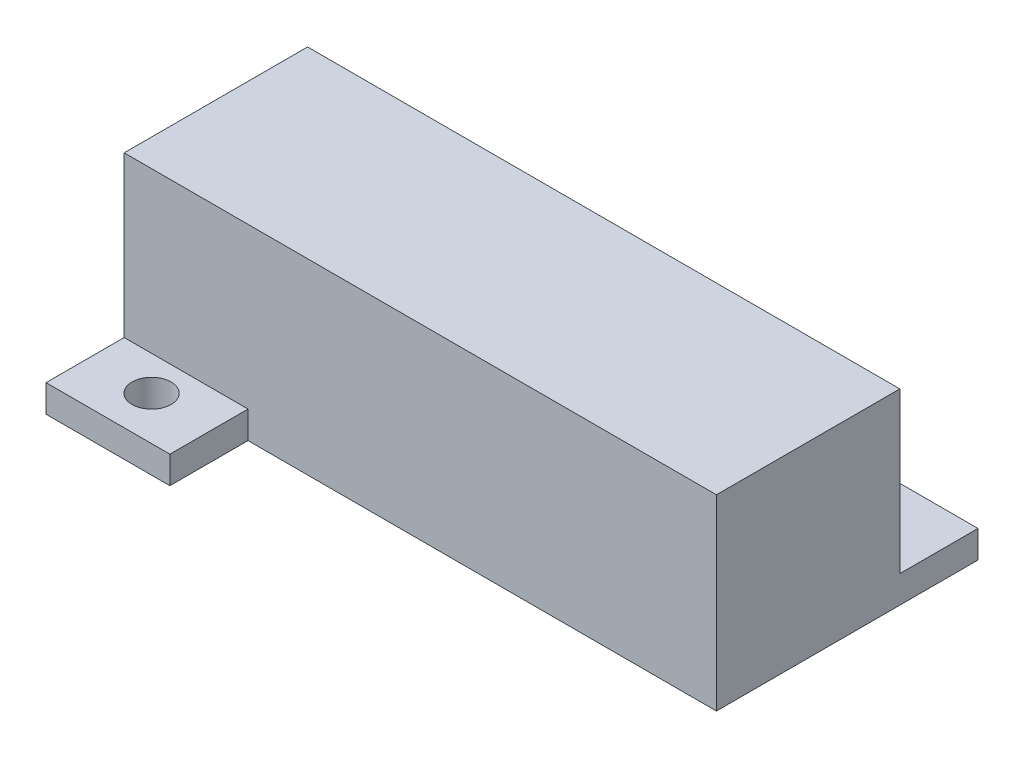
ISO-10303-21;
HEADER;
FILE_DESCRIPTION(('STEP AP214'),'2;1');
FILE_NAME('part.step','',(''),(''),'','','');
FILE_SCHEMA(('AUTOMOTIVE_DESIGN { 1 0 10303 214 1 1 1 1 }'));
ENDSEC;
DATA;
#1=APPLICATION_CONTEXT('core data for automotive mechanical design processes');
#2=APPLICATION_PROTOCOL_DEFINITION('international standard','automotive_design',2000,#1);
#3=PRODUCT_CONTEXT('',#1,'mechanical');
#4=PRODUCT('Part','Part','',(#3));
#5=PRODUCT_RELATED_PRODUCT_CATEGORY('part','',(#4));
#6=PRODUCT_DEFINITION_FORMATION('','',#4);
#7=PRODUCT_DEFINITION_CONTEXT('part definition',#1,'design');
#8=PRODUCT_DEFINITION('design','',#6,#7);
#9=PRODUCT_DEFINITION_SHAPE('','',#8);
#10=(LENGTH_UNIT() NAMED_UNIT(*) SI_UNIT(.MILLI.,.METRE.));
#11=(NAMED_UNIT(*) PLANE_ANGLE_UNIT() SI_UNIT($,.RADIAN.));
#12=(NAMED_UNIT(*) SI_UNIT($,.STERADIAN.) SOLID_ANGLE_UNIT());
#13=UNCERTAINTY_MEASURE_WITH_UNIT(LENGTH_MEASURE(1.E-05),#10,'distance_accuracy_value','');
#14=(GEOMETRIC_REPRESENTATION_CONTEXT(3) GLOBAL_UNCERTAINTY_ASSIGNED_CONTEXT((#13)) GLOBAL_UNIT_ASSIGNED_CONTEXT((#10,
#11,#12)) REPRESENTATION_CONTEXT('',''));
#15=CARTESIAN_POINT('',(0.,0.,0.));
#16=DIRECTION('',(0.,0.,1.));
#17=DIRECTION('',(1.,0.,0.));
#18=AXIS2_PLACEMENT_3D('',#15,#16,#17);
#19=CARTESIAN_POINT('',(0.,2.3114,0.));
#20=DIRECTION('',(0.,1.,0.));
#21=DIRECTION('',(0.,0.,1.));
#22=AXIS2_PLACEMENT_3D('',#19,#20,#21);
#23=PLANE('',#22);
#24=DIRECTION('',(1.,0.,0.));
#25=VECTOR('',#24,1.);
#26=CARTESIAN_POINT('',(50.038,2.3114,-6.604));
#27=LINE('',#26,#25);
#28=CARTESIAN_POINT('',(0.,2.3114,-6.604));
#29=VERTEX_POINT('',#28);
#30=CARTESIAN_POINT('',(10.4648,2.3114,-6.604));
#31=VERTEX_POINT('',#30);
#32=EDGE_CURVE('E55',#29,#31,#27,.T.);
#33=ORIENTED_EDGE('',*,*,#32,.F.);
#34=DIRECTION('',(0.,0.,1.));
#35=VECTOR('',#34,1.);
#36=CARTESIAN_POINT('',(0.,2.3114,-22.098));
#37=LINE('',#36,#35);
#38=CARTESIAN_POINT('',(0.,2.3114,0.));
#39=VERTEX_POINT('',#38);
#40=EDGE_CURVE('E151',#29,#39,#37,.T.);
#41=ORIENTED_EDGE('',*,*,#40,.T.);
#42=DIRECTION('',(1.,0.,0.));
#43=VECTOR('',#42,1.);
#44=CARTESIAN_POINT('',(0.,2.3114,0.));
#45=LINE('',#44,#43);
#46=CARTESIAN_POINT('',(10.4648,2.3114,0.));
#47=VERTEX_POINT('',#46);
#48=EDGE_CURVE('E153',#39,#47,#45,.T.);
#49=ORIENTED_EDGE('',*,*,#48,.T.);
#50=DIRECTION('',(0.,0.,-1.));
#51=VECTOR('',#50,1.);
#52=CARTESIAN_POINT('',(10.4648,2.3114,0.));
#53=LINE('',#52,#51);
#54=EDGE_CURVE('E156',#47,#31,#53,.T.);
#55=ORIENTED_EDGE('',*,*,#54,.T.);
#56=EDGE_LOOP('',(#33,#41,#49,#55));
#57=FACE_BOUND('',#56,.T.);
#58=CARTESIAN_POINT('',(5.2324,2.3114,-3.68299999999999));
#59=DIRECTION('',(0.,1.,0.));
#60=DIRECTION('',(0.,0.,1.));
#61=AXIS2_PLACEMENT_3D('',#58,#59,#60);
#62=CIRCLE('',#61,1.651);
#63=CARTESIAN_POINT('',(5.2324,2.3114,-2.03199999999999));
#64=VERTEX_POINT('',#63);
#65=EDGE_CURVE('E145',#64,#64,#62,.T.);
#66=ORIENTED_EDGE('',*,*,#65,.F.);
#67=EDGE_LOOP('',(#66));
#68=FACE_BOUND('',#67,.T.);
#69=ADVANCED_FACE('F32',(#57,#68),#23,.T.);
#70=DIRECTION('',(-1.,0.,0.));
#71=VECTOR('',#70,1.);
#72=CARTESIAN_POINT('',(50.038,2.3114,-22.098));
#73=LINE('',#72,#71);
#74=CARTESIAN_POINT('',(50.038,2.3114,-22.098));
#75=VERTEX_POINT('',#74);
#76=CARTESIAN_POINT('',(39.5732,2.3114,-22.098));
#77=VERTEX_POINT('',#76);
#78=EDGE_CURVE('E47',#75,#77,#73,.T.);
#79=ORIENTED_EDGE('',*,*,#78,.F.);
#80=DIRECTION('',(0.,0.,-1.));
#81=VECTOR('',#80,1.);
#82=CARTESIAN_POINT('',(50.038,2.3114,-6.604));
#83=LINE('',#82,#81);
#84=CARTESIAN_POINT('',(50.038,2.3114,-28.702));
#85=VERTEX_POINT('',#84);
#86=EDGE_CURVE('E131',#75,#85,#83,.T.);
#87=ORIENTED_EDGE('',*,*,#86,.T.);
#88=DIRECTION('',(-1.,0.,0.));
#89=VECTOR('',#88,1.);
#90=CARTESIAN_POINT('',(50.038,2.3114,-28.702));
#91=LINE('',#90,#89);
#92=CARTESIAN_POINT('',(39.5732,2.3114,-28.702));
#93=VERTEX_POINT('',#92);
#94=EDGE_CURVE('E159',#85,#93,#91,.T.);
#95=ORIENTED_EDGE('',*,*,#94,.T.);
#96=DIRECTION('',(0.,0.,1.));
#97=VECTOR('',#96,1.);
#98=CARTESIAN_POINT('',(39.5732,2.3114,-28.702));
#99=LINE('',#98,#97);
#100=EDGE_CURVE('E161',#93,#77,#99,.T.);
#101=ORIENTED_EDGE('',*,*,#100,.T.);
#102=EDGE_LOOP('',(#79,#87,#95,#101));
#103=FACE_BOUND('',#102,.T.);
#104=CARTESIAN_POINT('',(44.8056,2.3114,-25.019));
#105=DIRECTION('',(0.,1.,0.));
#106=DIRECTION('',(0.,0.,1.));
#107=AXIS2_PLACEMENT_3D('',#104,#105,#106);
#108=CIRCLE('',#107,1.651);
#109=CARTESIAN_POINT('',(44.8056,2.3114,-23.368));
#110=VERTEX_POINT('',#109);
#111=EDGE_CURVE('E136',#110,#110,#108,.T.);
#112=ORIENTED_EDGE('',*,*,#111,.F.);
#113=EDGE_LOOP('',(#112));
#114=FACE_BOUND('',#113,.T.);
#115=ADVANCED_FACE('F237',(#103,#114),#23,.T.);
#116=CARTESIAN_POINT('',(0.,0.,0.));
#117=DIRECTION('',(0.,1.,0.));
#118=DIRECTION('',(0.,0.,1.));
#119=AXIS2_PLACEMENT_3D('',#116,#117,#118);
#120=PLANE('',#119);
#121=DIRECTION('',(0.,0.,1.));
#122=VECTOR('',#121,1.);
#123=CARTESIAN_POINT('',(0.,0.,-22.098));
#124=LINE('',#123,#122);
#125=CARTESIAN_POINT('',(0.,0.,-22.098));
#126=VERTEX_POINT('',#125);
#127=CARTESIAN_POINT('',(0.,0.,0.));
#128=VERTEX_POINT('',#127);
#129=EDGE_CURVE('E148',#126,#128,#124,.T.);
#130=ORIENTED_EDGE('',*,*,#129,.F.);
#131=DIRECTION('',(-1.,0.,0.));
#132=VECTOR('',#131,1.);
#133=CARTESIAN_POINT('',(39.5732,0.,-22.098));
#134=LINE('',#133,#132);
#135=CARTESIAN_POINT('',(39.5732,0.,-22.098));
#136=VERTEX_POINT('',#135);
#137=EDGE_CURVE('E154',#136,#126,#134,.T.);
#138=ORIENTED_EDGE('',*,*,#137,.F.);
#139=DIRECTION('',(0.,0.,1.));
#140=VECTOR('',#139,1.);
#141=CARTESIAN_POINT('',(39.5732,0.,-28.702));
#142=LINE('',#141,#140);
#143=CARTESIAN_POINT('',(39.5732,0.,-28.702));
#144=VERTEX_POINT('',#143);
#145=EDGE_CURVE('E175',#144,#136,#142,.T.);
#146=ORIENTED_EDGE('',*,*,#145,.F.);
#147=DIRECTION('',(-1.,0.,0.));
#148=VECTOR('',#147,1.);
#149=CARTESIAN_POINT('',(50.038,0.,-28.702));
#150=LINE('',#149,#148);
#151=CARTESIAN_POINT('',(50.038,0.,-28.702));
#152=VERTEX_POINT('',#151);
#153=EDGE_CURVE('E173',#152,#144,#150,.T.);
#154=ORIENTED_EDGE('',*,*,#153,.F.);
#155=DIRECTION('',(0.,0.,-1.));
#156=VECTOR('',#155,1.);
#157=CARTESIAN_POINT('',(50.038,0.,-6.604));
#158=LINE('',#157,#156);
#159=CARTESIAN_POINT('',(50.038,0.,-6.604));
#160=VERTEX_POINT('',#159);
#161=EDGE_CURVE('E171',#160,#152,#158,.T.);
#162=ORIENTED_EDGE('',*,*,#161,.F.);
#163=DIRECTION('',(1.,0.,0.));
#164=VECTOR('',#163,1.);
#165=CARTESIAN_POINT('',(10.4648,0.,-6.604));
#166=LINE('',#165,#164);
#167=CARTESIAN_POINT('',(10.4648,0.,-6.604));
#168=VERTEX_POINT('',#167);
#169=EDGE_CURVE('E169',#168,#160,#166,.T.);
#170=ORIENTED_EDGE('',*,*,#169,.F.);
#171=DIRECTION('',(0.,0.,-1.));
#172=VECTOR('',#171,1.);
#173=CARTESIAN_POINT('',(10.4648,0.,0.));
#174=LINE('',#173,#172);
#175=CARTESIAN_POINT('',(10.4648,0.,0.));
#176=VERTEX_POINT('',#175);
#177=EDGE_CURVE('E167',#176,#168,#174,.T.);
#178=ORIENTED_EDGE('',*,*,#177,.F.);
#179=DIRECTION('',(1.,0.,0.));
#180=VECTOR('',#179,1.);
#181=CARTESIAN_POINT('',(0.,0.,0.));
#182=LINE('',#181,#180);
#183=EDGE_CURVE('E165',#128,#176,#182,.T.);
#184=ORIENTED_EDGE('',*,*,#183,.F.);
#185=EDGE_LOOP('',(#130,#138,#146,#154,#162,#170,#178,#184));
#186=FACE_BOUND('',#185,.T.);
#187=CARTESIAN_POINT('',(5.2324,0.,-3.68299999999999));
#188=DIRECTION('',(0.,1.,0.));
#189=DIRECTION('',(0.,0.,1.));
#190=AXIS2_PLACEMENT_3D('',#187,#188,#189);
#191=CIRCLE('',#190,1.651);
#192=CARTESIAN_POINT('',(5.2324,0.,-2.03199999999999));
#193=VERTEX_POINT('',#192);
#194=EDGE_CURVE('E143',#193,#193,#191,.T.);
#195=ORIENTED_EDGE('',*,*,#194,.T.);
#196=EDGE_LOOP('',(#195));
#197=FACE_BOUND('',#196,.T.);
#198=CARTESIAN_POINT('',(44.8056,0.,-25.019));
#199=DIRECTION('',(0.,1.,0.));
#200=DIRECTION('',(0.,0.,1.));
#201=AXIS2_PLACEMENT_3D('',#198,#199,#200);
#202=CIRCLE('',#201,1.651);
#203=CARTESIAN_POINT('',(44.8056,0.,-23.368));
#204=VERTEX_POINT('',#203);
#205=EDGE_CURVE('E132',#204,#204,#202,.T.);
#206=ORIENTED_EDGE('',*,*,#205,.T.);
#207=EDGE_LOOP('',(#206));
#208=FACE_BOUND('',#207,.T.);
#209=ADVANCED_FACE('F204',(#186,#197,#208),#120,.F.);
#210=CARTESIAN_POINT('',(0.,2.3114,-22.098));
#211=DIRECTION('',(1.,0.,0.));
#212=DIRECTION('',(0.,0.,-1.));
#213=AXIS2_PLACEMENT_3D('',#210,#211,#212);
#214=PLANE('',#213);
#215=ORIENTED_EDGE('',*,*,#129,.T.);
#216=DIRECTION('',(0.,-1.,0.));
#217=VECTOR('',#216,1.);
#218=CARTESIAN_POINT('',(0.,2.3114,0.));
#219=LINE('',#218,#217);
#220=EDGE_CURVE('E11',#39,#128,#219,.T.);
#221=ORIENTED_EDGE('',*,*,#220,.F.);
#222=ORIENTED_EDGE('',*,*,#40,.F.);
#223=DIRECTION('',(0.,-1.,0.));
#224=VECTOR('',#223,1.);
#225=CARTESIAN_POINT('',(0.,15.8242,-6.604));
#226=LINE('',#225,#224);
#227=CARTESIAN_POINT('',(0.,15.8242,-6.604));
#228=VERTEX_POINT('',#227);
#229=EDGE_CURVE('E133',#228,#29,#226,.T.);
#230=ORIENTED_EDGE('',*,*,#229,.F.);
#231=DIRECTION('',(0.,0.,1.));
#232=VECTOR('',#231,1.);
#233=CARTESIAN_POINT('',(0.,15.8242,-6.604));
#234=LINE('',#233,#232);
#235=CARTESIAN_POINT('',(0.,15.8242,-22.098));
#236=VERTEX_POINT('',#235);
#237=EDGE_CURVE('E118',#236,#228,#234,.T.);
#238=ORIENTED_EDGE('',*,*,#237,.F.);
#239=DIRECTION('',(0.,-1.,0.));
#240=VECTOR('',#239,1.);
#241=CARTESIAN_POINT('',(0.,2.3114,-22.098));
#242=LINE('',#241,#240);
#243=EDGE_CURVE('E115',#236,#126,#242,.T.);
#244=ORIENTED_EDGE('',*,*,#243,.T.);
#245=EDGE_LOOP('',(#215,#221,#222,#230,#238,#244));
#246=FACE_BOUND('',#245,.T.);
#247=ADVANCED_FACE('F34',(#246),#214,.F.);
#248=CARTESIAN_POINT('',(0.,2.3114,0.));
#249=DIRECTION('',(0.,0.,-1.));
#250=DIRECTION('',(-1.,0.,0.));
#251=AXIS2_PLACEMENT_3D('',#248,#249,#250);
#252=PLANE('',#251);
#253=ORIENTED_EDGE('',*,*,#183,.T.);
#254=DIRECTION('',(0.,-1.,0.));
#255=VECTOR('',#254,1.);
#256=CARTESIAN_POINT('',(10.4648,2.3114,0.));
#257=LINE('',#256,#255);
#258=EDGE_CURVE('E40',#47,#176,#257,.T.);
#259=ORIENTED_EDGE('',*,*,#258,.F.);
#260=ORIENTED_EDGE('',*,*,#48,.F.);
#261=ORIENTED_EDGE('',*,*,#220,.T.);
#262=EDGE_LOOP('',(#253,#259,#260,#261));
#263=FACE_BOUND('',#262,.T.);
#264=ADVANCED_FACE('F227',(#263),#252,.F.);
#265=CARTESIAN_POINT('',(10.4648,2.3114,0.));
#266=DIRECTION('',(-1.,0.,0.));
#267=DIRECTION('',(0.,0.,1.));
#268=AXIS2_PLACEMENT_3D('',#265,#266,#267);
#269=PLANE('',#268);
#270=ORIENTED_EDGE('',*,*,#177,.T.);
#271=DIRECTION('',(0.,-1.,0.));
#272=VECTOR('',#271,1.);
#273=CARTESIAN_POINT('',(10.4648,2.3114,-6.604));
#274=LINE('',#273,#272);
#275=EDGE_CURVE('E190',#31,#168,#274,.T.);
#276=ORIENTED_EDGE('',*,*,#275,.F.);
#277=ORIENTED_EDGE('',*,*,#54,.F.);
#278=ORIENTED_EDGE('',*,*,#258,.T.);
#279=EDGE_LOOP('',(#270,#276,#277,#278));
#280=FACE_BOUND('',#279,.T.);
#281=ADVANCED_FACE('F197',(#280),#269,.F.);
#282=CARTESIAN_POINT('',(10.4648,2.3114,-6.604));
#283=DIRECTION('',(0.,0.,-1.));
#284=DIRECTION('',(-1.,0.,0.));
#285=AXIS2_PLACEMENT_3D('',#282,#283,#284);
#286=PLANE('',#285);
#287=ORIENTED_EDGE('',*,*,#169,.T.);
#288=DIRECTION('',(0.,-1.,0.));
#289=VECTOR('',#288,1.);
#290=CARTESIAN_POINT('',(50.038,2.3114,-6.604));
#291=LINE('',#290,#289);
#292=CARTESIAN_POINT('',(50.038,15.8242,-6.604));
#293=VERTEX_POINT('',#292);
#294=EDGE_CURVE('E188',#293,#160,#291,.T.);
#295=ORIENTED_EDGE('',*,*,#294,.F.);
#296=DIRECTION('',(1.,0.,0.));
#297=VECTOR('',#296,1.);
#298=CARTESIAN_POINT('',(50.038,15.8242,-6.604));
#299=LINE('',#298,#297);
#300=EDGE_CURVE('E125',#228,#293,#299,.T.);
#301=ORIENTED_EDGE('',*,*,#300,.F.);
#302=ORIENTED_EDGE('',*,*,#229,.T.);
#303=ORIENTED_EDGE('',*,*,#32,.T.);
#304=ORIENTED_EDGE('',*,*,#275,.T.);
#305=EDGE_LOOP('',(#287,#295,#301,#302,#303,#304));
#306=FACE_BOUND('',#305,.T.);
#307=ADVANCED_FACE('F209',(#306),#286,.F.);
#308=CARTESIAN_POINT('',(50.038,2.3114,-6.604));
#309=DIRECTION('',(-1.,0.,0.));
#310=DIRECTION('',(0.,0.,1.));
#311=AXIS2_PLACEMENT_3D('',#308,#309,#310);
#312=PLANE('',#311);
#313=ORIENTED_EDGE('',*,*,#161,.T.);
#314=DIRECTION('',(0.,-1.,0.));
#315=VECTOR('',#314,1.);
#316=CARTESIAN_POINT('',(50.038,2.3114,-28.702));
#317=LINE('',#316,#315);
#318=EDGE_CURVE('E185',#85,#152,#317,.T.);
#319=ORIENTED_EDGE('',*,*,#318,.F.);
#320=ORIENTED_EDGE('',*,*,#86,.F.);
#321=DIRECTION('',(0.,-1.,0.));
#322=VECTOR('',#321,1.);
#323=CARTESIAN_POINT('',(50.038,15.8242,-22.098));
#324=LINE('',#323,#322);
#325=CARTESIAN_POINT('',(50.038,15.8242,-22.098));
#326=VERTEX_POINT('',#325);
#327=EDGE_CURVE('E113',#326,#75,#324,.T.);
#328=ORIENTED_EDGE('',*,*,#327,.F.);
#329=DIRECTION('',(0.,0.,-1.));
#330=VECTOR('',#329,1.);
#331=CARTESIAN_POINT('',(50.038,15.8242,-6.604));
#332=LINE('',#331,#330);
#333=EDGE_CURVE('E119',#293,#326,#332,.T.);
#334=ORIENTED_EDGE('',*,*,#333,.F.);
#335=ORIENTED_EDGE('',*,*,#294,.T.);
#336=EDGE_LOOP('',(#313,#319,#320,#328,#334,#335));
#337=FACE_BOUND('',#336,.T.);
#338=ADVANCED_FACE('F129',(#337),#312,.F.);
#339=CARTESIAN_POINT('',(50.038,2.3114,-28.702));
#340=DIRECTION('',(0.,0.,1.));
#341=DIRECTION('',(1.,0.,0.));
#342=AXIS2_PLACEMENT_3D('',#339,#340,#341);
#343=PLANE('',#342);
#344=ORIENTED_EDGE('',*,*,#153,.T.);
#345=DIRECTION('',(0.,-1.,0.));
#346=VECTOR('',#345,1.);
#347=CARTESIAN_POINT('',(39.5732,2.3114,-28.702));
#348=LINE('',#347,#346);
#349=EDGE_CURVE('E182',#93,#144,#348,.T.);
#350=ORIENTED_EDGE('',*,*,#349,.F.);
#351=ORIENTED_EDGE('',*,*,#94,.F.);
#352=ORIENTED_EDGE('',*,*,#318,.T.);
#353=EDGE_LOOP('',(#344,#350,#351,#352));
#354=FACE_BOUND('',#353,.T.);
#355=ADVANCED_FACE('F212',(#354),#343,.F.);
#356=CARTESIAN_POINT('',(39.5732,2.3114,-28.702));
#357=DIRECTION('',(1.,0.,0.));
#358=DIRECTION('',(0.,0.,-1.));
#359=AXIS2_PLACEMENT_3D('',#356,#357,#358);
#360=PLANE('',#359);
#361=ORIENTED_EDGE('',*,*,#145,.T.);
#362=DIRECTION('',(0.,-1.,0.));
#363=VECTOR('',#362,1.);
#364=CARTESIAN_POINT('',(39.5732,2.3114,-22.098));
#365=LINE('',#364,#363);
#366=EDGE_CURVE('E179',#77,#136,#365,.T.);
#367=ORIENTED_EDGE('',*,*,#366,.F.);
#368=ORIENTED_EDGE('',*,*,#100,.F.);
#369=ORIENTED_EDGE('',*,*,#349,.T.);
#370=EDGE_LOOP('',(#361,#367,#368,#369));
#371=FACE_BOUND('',#370,.T.);
#372=ADVANCED_FACE('F218',(#371),#360,.F.);
#373=CARTESIAN_POINT('',(39.5732,2.3114,-22.098));
#374=DIRECTION('',(0.,0.,1.));
#375=DIRECTION('',(1.,0.,0.));
#376=AXIS2_PLACEMENT_3D('',#373,#374,#375);
#377=PLANE('',#376);
#378=ORIENTED_EDGE('',*,*,#137,.T.);
#379=ORIENTED_EDGE('',*,*,#243,.F.);
#380=DIRECTION('',(-1.,0.,0.));
#381=VECTOR('',#380,1.);
#382=CARTESIAN_POINT('',(50.038,15.8242,-22.098));
#383=LINE('',#382,#381);
#384=EDGE_CURVE('E109',#326,#236,#383,.T.);
#385=ORIENTED_EDGE('',*,*,#384,.F.);
#386=ORIENTED_EDGE('',*,*,#327,.T.);
#387=ORIENTED_EDGE('',*,*,#78,.T.);
#388=ORIENTED_EDGE('',*,*,#366,.T.);
#389=EDGE_LOOP('',(#378,#379,#385,#386,#387,#388));
#390=FACE_BOUND('',#389,.T.);
#391=ADVANCED_FACE('F111',(#390),#377,.F.);
#392=CARTESIAN_POINT('',(5.2324,2.3114,-3.68299999999999));
#393=DIRECTION('',(0.,-1.,0.));
#394=DIRECTION('',(0.,0.,-1.));
#395=AXIS2_PLACEMENT_3D('',#392,#393,#394);
#396=CYLINDRICAL_SURFACE('',#395,1.651);
#397=ORIENTED_EDGE('',*,*,#65,.T.);
#398=EDGE_LOOP('',(#397));
#399=FACE_BOUND('',#398,.T.);
#400=ORIENTED_EDGE('',*,*,#194,.F.);
#401=EDGE_LOOP('',(#400));
#402=FACE_BOUND('',#401,.T.);
#403=ADVANCED_FACE('F245',(#399,#402),#396,.F.);
#404=CARTESIAN_POINT('',(44.8056,2.3114,-25.019));
#405=DIRECTION('',(0.,-1.,0.));
#406=DIRECTION('',(0.,0.,-1.));
#407=AXIS2_PLACEMENT_3D('',#404,#405,#406);
#408=CYLINDRICAL_SURFACE('',#407,1.651);
#409=ORIENTED_EDGE('',*,*,#111,.T.);
#410=EDGE_LOOP('',(#409));
#411=FACE_BOUND('',#410,.T.);
#412=ORIENTED_EDGE('',*,*,#205,.F.);
#413=EDGE_LOOP('',(#412));
#414=FACE_BOUND('',#413,.T.);
#415=ADVANCED_FACE('F275',(#411,#414),#408,.F.);
#416=CARTESIAN_POINT('',(0.,15.8242,0.));
#417=DIRECTION('',(0.,1.,0.));
#418=DIRECTION('',(0.,0.,1.));
#419=AXIS2_PLACEMENT_3D('',#416,#417,#418);
#420=PLANE('',#419);
#421=ORIENTED_EDGE('',*,*,#333,.T.);
#422=ORIENTED_EDGE('',*,*,#384,.T.);
#423=ORIENTED_EDGE('',*,*,#237,.T.);
#424=ORIENTED_EDGE('',*,*,#300,.T.);
#425=EDGE_LOOP('',(#421,#422,#423,#424));
#426=FACE_BOUND('',#425,.T.);
#427=ADVANCED_FACE('F123',(#426),#420,.T.);
#428=CLOSED_SHELL('',(#69,#115,#209,#247,#264,#281,#307,#338,#355,#372,#391,#403,#415,#427));
#429=MANIFOLD_SOLID_BREP('B2',#428);
#430=ADVANCED_BREP_SHAPE_REPRESENTATION('',(#18,#429),#14);
#431=SHAPE_DEFINITION_REPRESENTATION(#9,#430);
ENDSEC;
END-ISO-10303-21;
